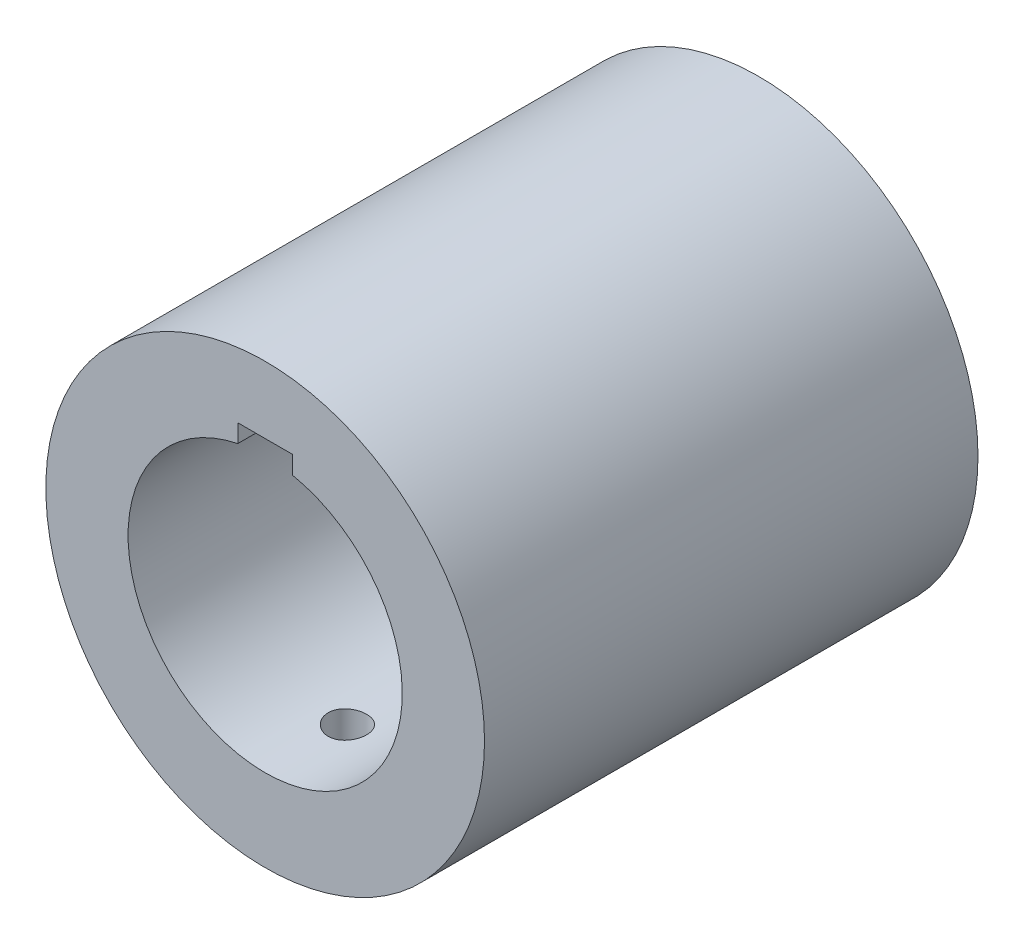
ISO-10303-21;
HEADER;
FILE_DESCRIPTION(('STEP AP214'),'2;1');
FILE_NAME('part.step','',(''),(''),'','','');
FILE_SCHEMA(('AUTOMOTIVE_DESIGN { 1 0 10303 214 1 1 1 1 }'));
ENDSEC;
DATA;
#1=APPLICATION_CONTEXT('core data for automotive mechanical design processes');
#2=APPLICATION_PROTOCOL_DEFINITION('international standard','automotive_design',2000,#1);
#3=PRODUCT_CONTEXT('',#1,'mechanical');
#4=PRODUCT('Part','Part','',(#3));
#5=PRODUCT_RELATED_PRODUCT_CATEGORY('part','',(#4));
#6=PRODUCT_DEFINITION_FORMATION('','',#4);
#7=PRODUCT_DEFINITION_CONTEXT('part definition',#1,'design');
#8=PRODUCT_DEFINITION('design','',#6,#7);
#9=PRODUCT_DEFINITION_SHAPE('','',#8);
#10=(LENGTH_UNIT() NAMED_UNIT(*) SI_UNIT(.MILLI.,.METRE.));
#11=(NAMED_UNIT(*) PLANE_ANGLE_UNIT() SI_UNIT($,.RADIAN.));
#12=(NAMED_UNIT(*) SI_UNIT($,.STERADIAN.) SOLID_ANGLE_UNIT());
#13=UNCERTAINTY_MEASURE_WITH_UNIT(LENGTH_MEASURE(1.E-05),#10,'distance_accuracy_value','');
#14=(GEOMETRIC_REPRESENTATION_CONTEXT(3) GLOBAL_UNCERTAINTY_ASSIGNED_CONTEXT((#13)) GLOBAL_UNIT_ASSIGNED_CONTEXT((#10,
#11,#12)) REPRESENTATION_CONTEXT('',''));
#15=CARTESIAN_POINT('',(0.,0.,0.));
#16=DIRECTION('',(0.,0.,1.));
#17=DIRECTION('',(1.,0.,0.));
#18=AXIS2_PLACEMENT_3D('',#15,#16,#17);
#19=CARTESIAN_POINT('',(0.,0.,-5.));
#20=DIRECTION('',(0.,0.,1.));
#21=DIRECTION('',(1.,0.,0.));
#22=AXIS2_PLACEMENT_3D('',#19,#20,#21);
#23=PLANE('',#22);
#24=CARTESIAN_POINT('',(0.,0.,-5.));
#25=DIRECTION('',(0.,0.,1.));
#26=DIRECTION('',(1.,0.,0.));
#27=AXIS2_PLACEMENT_3D('',#24,#25,#26);
#28=CIRCLE('',#27,25.);
#29=CARTESIAN_POINT('',(-22.5,10.8972473588517,-5.));
#30=VERTEX_POINT('',#29);
#31=CARTESIAN_POINT('',(-22.5,-10.8972473588517,-5.));
#32=VERTEX_POINT('',#31);
#33=EDGE_CURVE('E333',#30,#32,#28,.T.);
#34=ORIENTED_EDGE('',*,*,#33,.T.);
#35=DIRECTION('',(0.,1.,0.));
#36=VECTOR('',#35,1.);
#37=CARTESIAN_POINT('',(-22.5,-22.5,-5.));
#38=LINE('',#37,#36);
#39=EDGE_CURVE('E165',#32,#30,#38,.T.);
#40=ORIENTED_EDGE('',*,*,#39,.T.);
#41=EDGE_LOOP('',(#34,#40));
#42=FACE_BOUND('',#41,.T.);
#43=ADVANCED_FACE('F34',(#42),#23,.T.);
#44=CARTESIAN_POINT('',(-10.8972473588517,-22.5,-5.));
#45=VERTEX_POINT('',#44);
#46=CARTESIAN_POINT('',(10.8972473588517,-22.5,-5.));
#47=VERTEX_POINT('',#46);
#48=EDGE_CURVE('E336',#45,#47,#28,.T.);
#49=ORIENTED_EDGE('',*,*,#48,.T.);
#50=DIRECTION('',(-1.,0.,0.));
#51=VECTOR('',#50,1.);
#52=CARTESIAN_POINT('',(22.5,-22.5,-5.));
#53=LINE('',#52,#51);
#54=EDGE_CURVE('E181',#47,#45,#53,.T.);
#55=ORIENTED_EDGE('',*,*,#54,.T.);
#56=EDGE_LOOP('',(#49,#55));
#57=FACE_BOUND('',#56,.T.);
#58=ADVANCED_FACE('F270',(#57),#23,.T.);
#59=CARTESIAN_POINT('',(22.5,-10.8972473588517,-5.));
#60=VERTEX_POINT('',#59);
#61=CARTESIAN_POINT('',(22.5,10.8972473588517,-5.));
#62=VERTEX_POINT('',#61);
#63=EDGE_CURVE('E205',#60,#62,#28,.T.);
#64=ORIENTED_EDGE('',*,*,#63,.T.);
#65=DIRECTION('',(0.,-1.,0.));
#66=VECTOR('',#65,1.);
#67=CARTESIAN_POINT('',(22.5,-22.5,-5.));
#68=LINE('',#67,#66);
#69=EDGE_CURVE('E176',#62,#60,#68,.T.);
#70=ORIENTED_EDGE('',*,*,#69,.T.);
#71=EDGE_LOOP('',(#64,#70));
#72=FACE_BOUND('',#71,.T.);
#73=ADVANCED_FACE('F297',(#72),#23,.T.);
#74=CARTESIAN_POINT('',(10.8972473588517,22.5,-5.));
#75=VERTEX_POINT('',#74);
#76=CARTESIAN_POINT('',(-10.8972473588517,22.5,-5.));
#77=VERTEX_POINT('',#76);
#78=EDGE_CURVE('E204',#75,#77,#28,.T.);
#79=ORIENTED_EDGE('',*,*,#78,.T.);
#80=DIRECTION('',(1.,0.,0.));
#81=VECTOR('',#80,1.);
#82=CARTESIAN_POINT('',(22.5,22.5,-5.));
#83=LINE('',#82,#81);
#84=EDGE_CURVE('E171',#77,#75,#83,.T.);
#85=ORIENTED_EDGE('',*,*,#84,.T.);
#86=EDGE_LOOP('',(#79,#85));
#87=FACE_BOUND('',#86,.T.);
#88=ADVANCED_FACE('F272',(#87),#23,.T.);
#89=CARTESIAN_POINT('',(0.,0.,45.));
#90=DIRECTION('',(0.,0.,-1.));
#91=DIRECTION('',(-1.,0.,0.));
#92=AXIS2_PLACEMENT_3D('',#89,#90,#91);
#93=CYLINDRICAL_SURFACE('',#92,40.);
#94=CARTESIAN_POINT('',(3.50000000000001,-39.8465807817936,30.));
#95=CARTESIAN_POINT('',(3.49999144548066,-39.8465828091978,29.8038076306384));
#96=CARTESIAN_POINT('',(3.48344815437601,-39.848045370637,29.6074825909658));
#97=CARTESIAN_POINT('',(3.4176988145616,-39.8537373598452,29.2202671572285));
#98=CARTESIAN_POINT('',(3.36845599242042,-39.8579699026186,29.0293831343979));
#99=CARTESIAN_POINT('',(3.23874494533818,-39.8687188270403,28.6587137969815));
#100=CARTESIAN_POINT('',(3.15829470883662,-39.8752338927977,28.4789221576453));
#101=CARTESIAN_POINT('',(2.96848513385316,-39.8898121410542,28.135436284568));
#102=CARTESIAN_POINT('',(2.85913187331912,-39.8978749979746,27.9717386763694));
#103=CARTESIAN_POINT('',(2.61428817223653,-39.9146658266153,27.6645847506284));
#104=CARTESIAN_POINT('',(2.4787330919829,-39.9233954102467,27.5211800431389));
#105=CARTESIAN_POINT('',(2.18547081865469,-39.9405213601566,27.2591262991693));
#106=CARTESIAN_POINT('',(2.02776264776274,-39.9489177117055,27.1404783560052));
#107=CARTESIAN_POINT('',(1.69436079423247,-39.9644466087716,26.9311325562092));
#108=CARTESIAN_POINT('',(1.51863878883185,-39.97157711442,26.8404796419022));
#109=CARTESIAN_POINT('',(1.15439470745123,-39.9837534892168,26.6899846770912));
#110=CARTESIAN_POINT('',(0.965872876046101,-39.9887993981841,26.630142038062));
#111=CARTESIAN_POINT('',(0.581896545684229,-39.9962267639801,26.5431156879006));
#112=CARTESIAN_POINT('',(0.386461189328916,-39.9986150619891,26.5158481091684));
#113=CARTESIAN_POINT('',(-0.00622581578569751,-40.00048131454,26.4944865869159));
#114=CARTESIAN_POINT('',(-0.203477427580253,-39.9999593281823,26.500391969737));
#115=CARTESIAN_POINT('',(-0.5936288706037,-39.9960694592647,26.5451402698188));
#116=CARTESIAN_POINT('',(-0.786539134147017,-39.9927093690809,26.5838930015135));
#117=CARTESIAN_POINT('',(-1.16310660926702,-39.9835301116565,26.6930956586766));
#118=CARTESIAN_POINT('',(-1.34676372516993,-39.9777109189955,26.7635459118098));
#119=CARTESIAN_POINT('',(-1.69989790472234,-39.9642546126829,26.9342439214751));
#120=CARTESIAN_POINT('',(-1.86935540156573,-39.9566150445127,27.0345319558154));
#121=CARTESIAN_POINT('',(-2.1890665183457,-39.9403762100968,27.2620294743335));
#122=CARTESIAN_POINT('',(-2.33931970809755,-39.931776922361,27.3892395614074));
#123=CARTESIAN_POINT('',(-2.61688459673902,-39.9145507289992,27.6674781976517));
#124=CARTESIAN_POINT('',(-2.7441177325303,-39.9059238273874,27.8185851330038));
#125=CARTESIAN_POINT('',(-2.97142357440566,-39.8896436410195,28.1400552481662));
#126=CARTESIAN_POINT('',(-3.07149625462265,-39.8819903571907,28.3104184463156));
#127=CARTESIAN_POINT('',(-3.24163810647107,-39.8685227104348,28.6656214780195));
#128=CARTESIAN_POINT('',(-3.31170302023215,-39.8627086085041,28.8504633615892));
#129=CARTESIAN_POINT('',(-3.41978135650428,-39.8535828139277,29.2293496459934));
#130=CARTESIAN_POINT('',(-3.45779552297568,-39.8502710631978,29.4233938331142));
#131=CARTESIAN_POINT('',(-3.50059345308564,-39.8465345365353,29.8144885384048));
#132=CARTESIAN_POINT('',(-3.50548685603158,-39.8461002355129,30.0115269714325));
#133=CARTESIAN_POINT('',(-3.48219172428613,-39.8481426439256,30.4036212649625));
#134=CARTESIAN_POINT('',(-3.4540035302992,-39.8506193233807,30.598677145862));
#135=CARTESIAN_POINT('',(-3.36543684319893,-39.8581959549085,30.9809535341852));
#136=CARTESIAN_POINT('',(-3.30510967350783,-39.8632917240446,31.1681860222843));
#137=CARTESIAN_POINT('',(-3.15402972829005,-39.8755289233432,31.5298722032186));
#138=CARTESIAN_POINT('',(-3.06327641551469,-39.8826703896271,31.7043256703425));
#139=CARTESIAN_POINT('',(-2.85364355220502,-39.8982174090971,32.0360029727911));
#140=CARTESIAN_POINT('',(-2.73469103541274,-39.9066262206652,32.1931805355729));
#141=CARTESIAN_POINT('',(-2.47214158373285,-39.923749540086,32.4853763013431));
#142=CARTESIAN_POINT('',(-2.32854418162125,-39.9324640537318,32.6203940841258));
#143=CARTESIAN_POINT('',(-2.02030694242063,-39.9492453285108,32.8648127655354));
#144=CARTESIAN_POINT('',(-1.85561045090269,-39.9573102467596,32.9741423610453));
#145=CARTESIAN_POINT('',(-1.51013187344782,-39.9718570116321,33.1635916349912));
#146=CARTESIAN_POINT('',(-1.3293499623784,-39.9783388754626,33.2437116309218));
#147=CARTESIAN_POINT('',(-0.957086237403806,-39.9889807598233,33.3723453202784));
#148=CARTESIAN_POINT('',(-0.765619672356685,-39.9931440006835,33.4209028664738));
#149=CARTESIAN_POINT('',(-0.377213164756257,-39.9986926647472,33.4851765644692));
#150=CARTESIAN_POINT('',(-0.180273337576417,-40.0000781464594,33.5008934080025));
#151=CARTESIAN_POINT('',(0.212787038994882,-39.9999152489767,33.499031111851));
#152=CARTESIAN_POINT('',(0.408908127981969,-39.998376652303,33.4815629927268));
#153=CARTESIAN_POINT('',(0.795419488403757,-39.9925578027594,33.414058443548));
#154=CARTESIAN_POINT('',(0.9858097527334,-39.9882775464905,33.3640219731171));
#155=CARTESIAN_POINT('',(1.3554602489793,-39.9774554569329,33.2328299108569));
#156=CARTESIAN_POINT('',(1.53472130267503,-39.9709137908613,33.1516766198725));
#157=CARTESIAN_POINT('',(1.8770931421579,-39.9563001116113,32.9605670102535));
#158=CARTESIAN_POINT('',(2.04020414549786,-39.9482281190517,32.8506110796837));
#159=CARTESIAN_POINT('',(2.34621428686656,-39.9314271997662,32.6046005329049));
#160=CARTESIAN_POINT('',(2.48904712405537,-39.9226962548576,32.4684635834654));
#161=CARTESIAN_POINT('',(2.74989605095886,-39.9055786509445,32.1741083770454));
#162=CARTESIAN_POINT('',(2.86790613565591,-39.8971920756425,32.0158847923235));
#163=CARTESIAN_POINT('',(3.07593701159276,-39.8816944096419,31.6815100826822));
#164=CARTESIAN_POINT('',(3.16590059037033,-39.8745859385002,31.5053232728094));
#165=CARTESIAN_POINT('',(3.31485117004145,-39.8624810786097,31.1404009695002));
#166=CARTESIAN_POINT('',(3.3738736278164,-39.8574822735824,30.9516801201837));
#167=CARTESIAN_POINT('',(3.4443070897574,-39.8514425308533,30.6348800544647));
#168=CARTESIAN_POINT('',(3.46516398839713,-39.8496278116174,30.508835647448));
#169=CARTESIAN_POINT('',(3.4930132051891,-39.8471962794243,30.2552128736929));
#170=CARTESIAN_POINT('',(3.50000556521084,-39.8465794628496,30.1276345115881));
#171=CARTESIAN_POINT('',(3.50000000000001,-39.8465807817936,30.));
#172=B_SPLINE_CURVE_WITH_KNOTS('',3,(#94,#95,#96,#97,#98,#99,#100,#101,#102,#103,#104,#105,#106,
#107,#108,#109,#110,#111,#112,#113,#114,#115,#116,#117,#118,#119,#120,#121,#122,#123,#124,#125,
#126,#127,#128,#129,#130,#131,#132,#133,#134,#135,#136,#137,#138,#139,#140,#141,#142,#143,#144,
#145,#146,#147,#148,#149,#150,#151,#152,#153,#154,#155,#156,#157,#158,#159,#160,#161,#162,#163,
#164,#165,#166,#167,#168,#169,#170,#171),.UNSPECIFIED.,.T.,.F.,(4,2,2,2,2,2,2,2,2,2,2,2,2,2,2,2,
2,2,2,2,2,2,2,2,2,2,2,2,2,2,2,2,2,2,2,2,2,2,4),(0.,0.588111071995443,1.17688464802145,
1.76531934888771,2.35363040754074,2.94341178894665,3.53321921095353,4.12396862695151,
4.71470675827924,5.30392067744263,5.89312263121222,6.48071209478253,7.06830763254131,
7.6566999882121,8.2451055218155,8.83548277629812,9.4258605930425,10.0163221521094,
10.6067700050348,11.1952623447368,11.783748623661,12.3712979408373,12.9588576331943,
13.5479545747795,14.1370626858477,14.7277871702286,15.3185052335208,15.9084007906091,
16.4982839224291,17.086197070165,17.6741109467635,18.2619813601186,18.849843853358,
19.4395861960251,20.0294710430546,20.6205514476906,21.2109530166834,21.5935545233698,
21.976154874637),.UNSPECIFIED.);
#173=CARTESIAN_POINT('',(3.50000000000001,-39.8465807817936,30.));
#174=VERTEX_POINT('',#173);
#175=EDGE_CURVE('E156',#174,#174,#172,.T.);
#176=ORIENTED_EDGE('',*,*,#175,.T.);
#177=EDGE_LOOP('',(#176));
#178=FACE_BOUND('',#177,.T.);
#179=CARTESIAN_POINT('',(3.50000000000001,-39.8465807817936,-30.));
#180=CARTESIAN_POINT('',(3.49999144548066,-39.8465828091978,-30.1961923693616));
#181=CARTESIAN_POINT('',(3.48344815437601,-39.848045370637,-30.3925174090342));
#182=CARTESIAN_POINT('',(3.4176988145616,-39.8537373598452,-30.7797328427715));
#183=CARTESIAN_POINT('',(3.36845599242042,-39.8579699026186,-30.9706168656021));
#184=CARTESIAN_POINT('',(3.23874494533818,-39.8687188270403,-31.3412862030185));
#185=CARTESIAN_POINT('',(3.15829470883662,-39.8752338927977,-31.5210778423547));
#186=CARTESIAN_POINT('',(2.96848513385316,-39.8898121410542,-31.864563715432));
#187=CARTESIAN_POINT('',(2.85913187331912,-39.8978749979746,-32.0282613236306));
#188=CARTESIAN_POINT('',(2.61428817223653,-39.9146658266153,-32.3354152493716));
#189=CARTESIAN_POINT('',(2.4787330919829,-39.9233954102467,-32.4788199568611));
#190=CARTESIAN_POINT('',(2.18547081865469,-39.9405213601566,-32.7408737008307));
#191=CARTESIAN_POINT('',(2.02776264776274,-39.9489177117055,-32.8595216439948));
#192=CARTESIAN_POINT('',(1.69436079423247,-39.9644466087716,-33.0688674437908));
#193=CARTESIAN_POINT('',(1.51863878883184,-39.97157711442,-33.1595203580978));
#194=CARTESIAN_POINT('',(1.15439470745123,-39.9837534892168,-33.3100153229088));
#195=CARTESIAN_POINT('',(0.9658728760461,-39.9887993981841,-33.369857961938));
#196=CARTESIAN_POINT('',(0.581896545684229,-39.9962267639801,-33.4568843120994));
#197=CARTESIAN_POINT('',(0.386461189328916,-39.9986150619891,-33.4841518908316));
#198=CARTESIAN_POINT('',(-0.00622581578569732,-40.00048131454,-33.5055134130841));
#199=CARTESIAN_POINT('',(-0.203477427580253,-39.9999593281823,-33.499608030263));
#200=CARTESIAN_POINT('',(-0.5936288706037,-39.9960694592647,-33.4548597301812));
#201=CARTESIAN_POINT('',(-0.786539134147016,-39.9927093690809,-33.4161069984865));
#202=CARTESIAN_POINT('',(-1.16310660926701,-39.9835301116565,-33.3069043413234));
#203=CARTESIAN_POINT('',(-1.34676372516993,-39.9777109189955,-33.2364540881902));
#204=CARTESIAN_POINT('',(-1.69989790472234,-39.9642546126829,-33.0657560785249));
#205=CARTESIAN_POINT('',(-1.86935540156573,-39.9566150445127,-32.9654680441846));
#206=CARTESIAN_POINT('',(-2.18906651834569,-39.9403762100968,-32.7379705256665));
#207=CARTESIAN_POINT('',(-2.33931970809755,-39.931776922361,-32.6107604385926));
#208=CARTESIAN_POINT('',(-2.61688459673902,-39.9145507289992,-32.3325218023483));
#209=CARTESIAN_POINT('',(-2.7441177325303,-39.9059238273874,-32.1814148669962));
#210=CARTESIAN_POINT('',(-2.97142357440566,-39.8896436410195,-31.8599447518338));
#211=CARTESIAN_POINT('',(-3.07149625462265,-39.8819903571907,-31.6895815536844));
#212=CARTESIAN_POINT('',(-3.24163810647107,-39.8685227104348,-31.3343785219805));
#213=CARTESIAN_POINT('',(-3.31170302023215,-39.8627086085041,-31.1495366384108));
#214=CARTESIAN_POINT('',(-3.41978135650428,-39.8535828139277,-30.7706503540066));
#215=CARTESIAN_POINT('',(-3.45779552297568,-39.8502710631978,-30.5766061668858));
#216=CARTESIAN_POINT('',(-3.50059345308565,-39.8465345365353,-30.1855114615952));
#217=CARTESIAN_POINT('',(-3.50548685603158,-39.8461002355129,-29.9884730285675));
#218=CARTESIAN_POINT('',(-3.48219172428613,-39.8481426439256,-29.5963787350375));
#219=CARTESIAN_POINT('',(-3.4540035302992,-39.8506193233807,-29.401322854138));
#220=CARTESIAN_POINT('',(-3.36543684319893,-39.8581959549085,-29.0190464658147));
#221=CARTESIAN_POINT('',(-3.30510967350783,-39.8632917240446,-28.8318139777157));
#222=CARTESIAN_POINT('',(-3.15402972829006,-39.8755289233432,-28.4701277967814));
#223=CARTESIAN_POINT('',(-3.0632764155147,-39.8826703896271,-28.2956743296575));
#224=CARTESIAN_POINT('',(-2.85364355220502,-39.8982174090971,-27.9639970272089));
#225=CARTESIAN_POINT('',(-2.73469103541275,-39.9066262206652,-27.8068194644271));
#226=CARTESIAN_POINT('',(-2.47214158373286,-39.923749540086,-27.5146236986569));
#227=CARTESIAN_POINT('',(-2.32854418162126,-39.9324640537318,-27.3796059158742));
#228=CARTESIAN_POINT('',(-2.02030694242063,-39.9492453285108,-27.1351872344646));
#229=CARTESIAN_POINT('',(-1.85561045090269,-39.9573102467596,-27.0258576389547));
#230=CARTESIAN_POINT('',(-1.51013187344782,-39.9718570116321,-26.8364083650088));
#231=CARTESIAN_POINT('',(-1.3293499623784,-39.9783388754626,-26.7562883690782));
#232=CARTESIAN_POINT('',(-0.957086237403808,-39.9889807598233,-26.6276546797216));
#233=CARTESIAN_POINT('',(-0.765619672356687,-39.9931440006835,-26.5790971335262));
#234=CARTESIAN_POINT('',(-0.377213164756259,-39.9986926647472,-26.5148234355308));
#235=CARTESIAN_POINT('',(-0.180273337576418,-40.0000781464594,-26.4991065919975));
#236=CARTESIAN_POINT('',(0.212787038994882,-39.9999152489767,-26.500968888149));
#237=CARTESIAN_POINT('',(0.40890812798197,-39.998376652303,-26.5184370072732));
#238=CARTESIAN_POINT('',(0.795419488403758,-39.9925578027594,-26.585941556452));
#239=CARTESIAN_POINT('',(0.9858097527334,-39.9882775464905,-26.6359780268829));
#240=CARTESIAN_POINT('',(1.3554602489793,-39.9774554569329,-26.7671700891432));
#241=CARTESIAN_POINT('',(1.53472130267503,-39.9709137908613,-26.8483233801275));
#242=CARTESIAN_POINT('',(1.8770931421579,-39.9563001116113,-27.0394329897465));
#243=CARTESIAN_POINT('',(2.04020414549786,-39.9482281190517,-27.1493889203163));
#244=CARTESIAN_POINT('',(2.34621428686656,-39.9314271997662,-27.3953994670951));
#245=CARTESIAN_POINT('',(2.48904712405537,-39.9226962548576,-27.5315364165346));
#246=CARTESIAN_POINT('',(2.74989605095886,-39.9055786509445,-27.8258916229545));
#247=CARTESIAN_POINT('',(2.86790613565591,-39.8971920756425,-27.9841152076765));
#248=CARTESIAN_POINT('',(3.07593701159277,-39.8816944096419,-28.3184899173178));
#249=CARTESIAN_POINT('',(3.16590059037034,-39.8745859385002,-28.4946767271906));
#250=CARTESIAN_POINT('',(3.31485117004145,-39.8624810786097,-28.8595990304998));
#251=CARTESIAN_POINT('',(3.3738736278164,-39.8574822735824,-29.0483198798163));
#252=CARTESIAN_POINT('',(3.4443070897574,-39.8514425308533,-29.3651199455353));
#253=CARTESIAN_POINT('',(3.46516398839713,-39.8496278116174,-29.491164352552));
#254=CARTESIAN_POINT('',(3.4930132051891,-39.8471962794243,-29.7447871263071));
#255=CARTESIAN_POINT('',(3.50000556521084,-39.8465794628496,-29.8723654884119));
#256=CARTESIAN_POINT('',(3.50000000000001,-39.8465807817936,-30.));
#257=B_SPLINE_CURVE_WITH_KNOTS('',3,(#179,#180,#181,#182,#183,#184,#185,#186,#187,#188,#189,
#190,#191,#192,#193,#194,#195,#196,#197,#198,#199,#200,#201,#202,#203,#204,#205,#206,#207,#208,
#209,#210,#211,#212,#213,#214,#215,#216,#217,#218,#219,#220,#221,#222,#223,#224,#225,#226,#227,
#228,#229,#230,#231,#232,#233,#234,#235,#236,#237,#238,#239,#240,#241,#242,#243,#244,#245,#246,
#247,#248,#249,#250,#251,#252,#253,#254,#255,#256),.UNSPECIFIED.,.T.,.F.,(4,2,2,2,2,2,2,2,2,2,2,
2,2,2,2,2,2,2,2,2,2,2,2,2,2,2,2,2,2,2,2,2,2,2,2,2,2,2,4),(0.,0.588111071995446,1.17688464802145,
1.7653193488877,2.35363040754075,2.94341178894665,3.53321921095353,4.12396862695152,
4.71470675827924,5.30392067744263,5.89312263121222,6.48071209478253,7.06830763254131,
7.65669998821209,8.2451055218155,8.83548277629812,9.4258605930425,10.0163221521094,
10.6067700050348,11.1952623447368,11.783748623661,12.3712979408373,12.9588576331943,
13.5479545747795,14.1370626858477,14.7277871702286,15.3185052335208,15.9084007906091,
16.4982839224291,17.086197070165,17.6741109467635,18.2619813601186,18.849843853358,
19.4395861960251,20.0294710430546,20.6205514476906,21.2109530166834,21.5935545233698,
21.976154874637),.UNSPECIFIED.);
#258=CARTESIAN_POINT('',(3.50000000000001,-39.8465807817936,-30.));
#259=VERTEX_POINT('',#258);
#260=EDGE_CURVE('E216',#259,#259,#257,.T.);
#261=ORIENTED_EDGE('',*,*,#260,.T.);
#262=EDGE_LOOP('',(#261));
#263=FACE_BOUND('',#262,.T.);
#264=CARTESIAN_POINT('',(0.,0.,45.));
#265=DIRECTION('',(0.,0.,1.));
#266=DIRECTION('',(1.,0.,0.));
#267=AXIS2_PLACEMENT_3D('',#264,#265,#266);
#268=CIRCLE('',#267,40.);
#269=CARTESIAN_POINT('',(40.,0.,45.));
#270=VERTEX_POINT('',#269);
#271=EDGE_CURVE('E208',#270,#270,#268,.T.);
#272=ORIENTED_EDGE('',*,*,#271,.F.);
#273=EDGE_LOOP('',(#272));
#274=FACE_BOUND('',#273,.T.);
#275=CARTESIAN_POINT('',(0.,0.,-45.));
#276=DIRECTION('',(0.,0.,1.));
#277=DIRECTION('',(1.,0.,0.));
#278=AXIS2_PLACEMENT_3D('',#275,#276,#277);
#279=CIRCLE('',#278,40.);
#280=CARTESIAN_POINT('',(40.,0.,-45.));
#281=VERTEX_POINT('',#280);
#282=EDGE_CURVE('E203',#281,#281,#279,.T.);
#283=ORIENTED_EDGE('',*,*,#282,.T.);
#284=EDGE_LOOP('',(#283));
#285=FACE_BOUND('',#284,.T.);
#286=ADVANCED_FACE('F36',(#178,#263,#274,#285),#93,.T.);
#287=CARTESIAN_POINT('',(0.,0.,45.));
#288=DIRECTION('',(0.,0.,1.));
#289=DIRECTION('',(1.,0.,0.));
#290=AXIS2_PLACEMENT_3D('',#287,#288,#289);
#291=PLANE('',#290);
#292=DIRECTION('',(0.,-1.,0.));
#293=VECTOR('',#292,1.);
#294=CARTESIAN_POINT('',(-5.,15.79,45.));
#295=LINE('',#294,#293);
#296=CARTESIAN_POINT('',(-5.,27.79,45.));
#297=VERTEX_POINT('',#296);
#298=CARTESIAN_POINT('',(-5.,24.4948974278318,45.));
#299=VERTEX_POINT('',#298);
#300=EDGE_CURVE('E154',#297,#299,#295,.T.);
#301=ORIENTED_EDGE('',*,*,#300,.F.);
#302=DIRECTION('',(-1.,0.,0.));
#303=VECTOR('',#302,1.);
#304=CARTESIAN_POINT('',(5.,27.79,45.));
#305=LINE('',#304,#303);
#306=CARTESIAN_POINT('',(5.,27.79,45.));
#307=VERTEX_POINT('',#306);
#308=EDGE_CURVE('E158',#307,#297,#305,.T.);
#309=ORIENTED_EDGE('',*,*,#308,.F.);
#310=DIRECTION('',(0.,1.,0.));
#311=VECTOR('',#310,1.);
#312=CARTESIAN_POINT('',(5.,15.79,45.));
#313=LINE('',#312,#311);
#314=CARTESIAN_POINT('',(5.,24.4948974278318,45.));
#315=VERTEX_POINT('',#314);
#316=EDGE_CURVE('E144',#315,#307,#313,.T.);
#317=ORIENTED_EDGE('',*,*,#316,.F.);
#318=CARTESIAN_POINT('',(0.,0.,45.));
#319=DIRECTION('',(0.,0.,1.));
#320=DIRECTION('',(1.,0.,0.));
#321=AXIS2_PLACEMENT_3D('',#318,#319,#320);
#322=CIRCLE('',#321,25.);
#323=EDGE_CURVE('E194',#299,#315,#322,.T.);
#324=ORIENTED_EDGE('',*,*,#323,.F.);
#325=EDGE_LOOP('',(#301,#309,#317,#324));
#326=FACE_BOUND('',#325,.T.);
#327=ORIENTED_EDGE('',*,*,#271,.T.);
#328=EDGE_LOOP('',(#327));
#329=FACE_BOUND('',#328,.T.);
#330=ADVANCED_FACE('F279',(#326,#329),#291,.T.);
#331=CARTESIAN_POINT('',(0.,0.,-45.));
#332=DIRECTION('',(0.,0.,1.));
#333=DIRECTION('',(1.,0.,0.));
#334=AXIS2_PLACEMENT_3D('',#331,#332,#333);
#335=PLANE('',#334);
#336=DIRECTION('',(1.,0.,0.));
#337=VECTOR('',#336,1.);
#338=CARTESIAN_POINT('',(22.5,22.5,-45.));
#339=LINE('',#338,#337);
#340=CARTESIAN_POINT('',(-22.5,22.5,-45.));
#341=VERTEX_POINT('',#340);
#342=CARTESIAN_POINT('',(22.5,22.5,-45.));
#343=VERTEX_POINT('',#342);
#344=EDGE_CURVE('E183',#341,#343,#339,.T.);
#345=ORIENTED_EDGE('',*,*,#344,.F.);
#346=DIRECTION('',(0.,1.,0.));
#347=VECTOR('',#346,1.);
#348=CARTESIAN_POINT('',(-22.5,-22.5,-45.));
#349=LINE('',#348,#347);
#350=CARTESIAN_POINT('',(-22.5,-22.5,-45.));
#351=VERTEX_POINT('',#350);
#352=EDGE_CURVE('E160',#351,#341,#349,.T.);
#353=ORIENTED_EDGE('',*,*,#352,.F.);
#354=DIRECTION('',(-1.,0.,0.));
#355=VECTOR('',#354,1.);
#356=CARTESIAN_POINT('',(22.5,-22.5,-45.));
#357=LINE('',#356,#355);
#358=CARTESIAN_POINT('',(22.5,-22.5,-45.));
#359=VERTEX_POINT('',#358);
#360=EDGE_CURVE('E189',#359,#351,#357,.T.);
#361=ORIENTED_EDGE('',*,*,#360,.F.);
#362=DIRECTION('',(0.,-1.,0.));
#363=VECTOR('',#362,1.);
#364=CARTESIAN_POINT('',(22.5,-22.5,-45.));
#365=LINE('',#364,#363);
#366=EDGE_CURVE('E186',#343,#359,#365,.T.);
#367=ORIENTED_EDGE('',*,*,#366,.F.);
#368=EDGE_LOOP('',(#345,#353,#361,#367));
#369=FACE_BOUND('',#368,.T.);
#370=ORIENTED_EDGE('',*,*,#282,.F.);
#371=EDGE_LOOP('',(#370));
#372=FACE_BOUND('',#371,.T.);
#373=ADVANCED_FACE('F277',(#369,#372),#335,.F.);
#374=CARTESIAN_POINT('',(0.,0.,-5.));
#375=DIRECTION('',(0.,0.,1.));
#376=DIRECTION('',(1.,0.,0.));
#377=AXIS2_PLACEMENT_3D('',#374,#375,#376);
#378=CYLINDRICAL_SURFACE('',#377,25.);
#379=CARTESIAN_POINT('',(3.5,-24.7537875889731,30.));
#380=CARTESIAN_POINT('',(3.49999181655908,-24.7537906822583,30.1955601547676));
#381=CARTESIAN_POINT('',(3.48355443558926,-24.7561300920155,30.3912375074826));
#382=CARTESIAN_POINT('',(3.41825061741057,-24.76522981384,30.7771319227347));
#383=CARTESIAN_POINT('',(3.369351598623,-24.7719945675026,30.9673432987802));
#384=CARTESIAN_POINT('',(3.24060697003299,-24.7891640928697,31.3366635933041));
#385=CARTESIAN_POINT('',(3.16078395095831,-24.7995662068558,31.5157805060199));
#386=CARTESIAN_POINT('',(2.97250847563925,-24.8228352266466,31.8580487736026));
#387=CARTESIAN_POINT('',(2.86406036070284,-24.8357017586143,32.0212025443155));
#388=CARTESIAN_POINT('',(2.62080281251527,-24.8625504844522,32.3280821585328));
#389=CARTESIAN_POINT('',(2.48583292443021,-24.8765391460462,32.4716802619453));
#390=CARTESIAN_POINT('',(2.1937092685365,-24.9039980636581,32.7342668050627));
#391=CARTESIAN_POINT('',(2.03655433171448,-24.9174682923102,32.8532539471089));
#392=CARTESIAN_POINT('',(1.7037092427828,-24.9424397352459,33.0637071845744));
#393=CARTESIAN_POINT('',(1.5279445235745,-24.9539325035401,33.1550564349266));
#394=CARTESIAN_POINT('',(1.16337996516018,-24.9735826810557,33.3068916070161));
#395=CARTESIAN_POINT('',(0.974580728438621,-24.9817402443171,33.3673789541766));
#396=CARTESIAN_POINT('',(0.590618783329349,-24.9937552741093,33.4553882385259));
#397=CARTESIAN_POINT('',(0.395505865512715,-24.9976405609784,33.4831235400346));
#398=CARTESIAN_POINT('',(0.0033592271211936,-25.0007684801016,33.5055034093904));
#399=CARTESIAN_POINT('',(-0.19367439934007,-25.0000113387018,33.5001495905289));
#400=CARTESIAN_POINT('',(-0.582615400058754,-24.9939620558024,33.4566726713099));
#401=CARTESIAN_POINT('',(-0.774548993633266,-24.9887016775951,33.4187790823591));
#402=CARTESIAN_POINT('',(-1.14930594030171,-24.9742724352295,33.3116579163287));
#403=CARTESIAN_POINT('',(-1.33212908391207,-24.9651034812448,33.2424296191148));
#404=CARTESIAN_POINT('',(-1.68417680329686,-24.9438325860369,33.0743653931127));
#405=CARTESIAN_POINT('',(-1.85335410431119,-24.9317209865754,32.9754317089632));
#406=CARTESIAN_POINT('',(-2.17279223786522,-24.9059168552186,32.7508363280671));
#407=CARTESIAN_POINT('',(-2.32305198304022,-24.8922242325342,32.6251730960448));
#408=CARTESIAN_POINT('',(-2.60174071972401,-24.8646488503525,32.3494042316552));
#409=CARTESIAN_POINT('',(-2.72997158820307,-24.8507654670317,32.1990983593784));
#410=CARTESIAN_POINT('',(-2.95941854341812,-24.8244883316295,31.8789943235083));
#411=CARTESIAN_POINT('',(-3.06063450181283,-24.8120945866252,31.7091960673168));
#412=CARTESIAN_POINT('',(-3.23319870278262,-24.7902003566841,31.3547333711027));
#413=CARTESIAN_POINT('',(-3.30452848048122,-24.7807016614096,31.17005982428));
#414=CARTESIAN_POINT('',(-3.4151062164336,-24.7657059743542,30.7911922096729));
#415=CARTESIAN_POINT('',(-3.45435613146934,-24.7602087384978,30.5969987233443));
#416=CARTESIAN_POINT('',(-3.4993922100537,-24.7538840422246,30.2063609476892));
#417=CARTESIAN_POINT('',(-3.5054583674837,-24.7530175108533,30.009949548225));
#418=CARTESIAN_POINT('',(-3.48469592776276,-24.7559487782451,29.6189131069279));
#419=CARTESIAN_POINT('',(-3.45786821570799,-24.7597464515054,29.4242880171718));
#420=CARTESIAN_POINT('',(-3.37231633400958,-24.7715424400724,29.0432043339317));
#421=CARTESIAN_POINT('',(-3.31373000542301,-24.7795225973313,28.8567141846912));
#422=CARTESIAN_POINT('',(-3.16646669264685,-24.7987695354145,28.4962023722164));
#423=CARTESIAN_POINT('',(-3.0777884005381,-24.8100364590921,28.3221812513349));
#424=CARTESIAN_POINT('',(-2.87217909544422,-24.8346801452907,27.9902872650861));
#425=CARTESIAN_POINT('',(-2.7550658360138,-24.8480703159863,27.8325283143095));
#426=CARTESIAN_POINT('',(-2.49616615385767,-24.875410682501,27.5388042112551));
#427=CARTESIAN_POINT('',(-2.3543785207939,-24.8893609057662,27.4028401286975));
#428=CARTESIAN_POINT('',(-2.04892599936428,-24.9163707911094,27.1555689967601));
#429=CARTESIAN_POINT('',(-1.88511070591751,-24.9294233048069,27.044446847283));
#430=CARTESIAN_POINT('',(-1.54097657080112,-24.9530578482668,26.8512984093059));
#431=CARTESIAN_POINT('',(-1.36065813219229,-24.9636399383426,26.7692714104456));
#432=CARTESIAN_POINT('',(-0.989229139282787,-24.9811098395859,26.6369413435228));
#433=CARTESIAN_POINT('',(-0.798156053861411,-24.9880096937281,26.5865347628721));
#434=CARTESIAN_POINT('',(-0.410154489529999,-24.9973880303632,26.5185406087299));
#435=CARTESIAN_POINT('',(-0.213226346094652,-24.9998667656766,26.5009511585971));
#436=CARTESIAN_POINT('',(0.179096941501438,-25.000121613377,26.4991318441549));
#437=CARTESIAN_POINT('',(0.374490803444377,-24.9979377352712,26.5146181598069));
#438=CARTESIAN_POINT('',(0.759868138965532,-24.9891929064383,26.5779054710853));
#439=CARTESIAN_POINT('',(0.94985162365863,-24.9826319647038,26.6257064003208));
#440=CARTESIAN_POINT('',(1.31895434116068,-24.9658667061347,26.7521701107837));
#441=CARTESIAN_POINT('',(1.49807954152819,-24.9556644121669,26.8308157593527));
#442=CARTESIAN_POINT('',(1.84063575824958,-24.9327408556312,27.0167066789478));
#443=CARTESIAN_POINT('',(2.00406639879783,-24.9200195327676,27.123952634575));
#444=CARTESIAN_POINT('',(2.31203862615956,-24.8933445340092,27.3650365723487));
#445=CARTESIAN_POINT('',(2.45641476524127,-24.8793816286934,27.4990849008835));
#446=CARTESIAN_POINT('',(2.72072938480253,-24.8518678878302,27.7895269332121));
#447=CARTESIAN_POINT('',(2.84066210449927,-24.8383171500605,27.9459258898225));
#448=CARTESIAN_POINT('',(3.05319975931054,-24.8130916210476,28.277515709406));
#449=CARTESIAN_POINT('',(3.14566908745316,-24.801426264232,28.452794183429));
#450=CARTESIAN_POINT('',(3.29972220584237,-24.7814027288131,28.8164676001087));
#451=CARTESIAN_POINT('',(3.36133869990586,-24.7730410503233,29.0048484120192));
#452=CARTESIAN_POINT('',(3.43762752385745,-24.7625452599898,29.3284431130035));
#453=CARTESIAN_POINT('',(3.46098233554848,-24.759278094514,29.461639355196));
#454=CARTESIAN_POINT('',(3.49217131855817,-24.7548982019194,29.7298717689412));
#455=CARTESIAN_POINT('',(3.50000565308434,-24.7537854521456,29.8649079211311));
#456=CARTESIAN_POINT('',(3.5,-24.7537875889731,30.));
#457=B_SPLINE_CURVE_WITH_KNOTS('',3,(#379,#380,#381,#382,#383,#384,#385,#386,#387,#388,#389,
#390,#391,#392,#393,#394,#395,#396,#397,#398,#399,#400,#401,#402,#403,#404,#405,#406,#407,#408,
#409,#410,#411,#412,#413,#414,#415,#416,#417,#418,#419,#420,#421,#422,#423,#424,#425,#426,#427,
#428,#429,#430,#431,#432,#433,#434,#435,#436,#437,#438,#439,#440,#441,#442,#443,#444,#445,#446,
#447,#448,#449,#450,#451,#452,#453,#454,#455,#456),.UNSPECIFIED.,.T.,.F.,(4,2,2,2,2,2,2,2,2,2,2,
2,2,2,2,2,2,2,2,2,2,2,2,2,2,2,2,2,2,2,2,2,2,2,2,2,2,2,4),(0.,0.586186802715843,1.17296284945571,
1.75931104800062,2.34557037149055,2.93549224141235,3.52544520813938,4.11785855282521,
4.71024453315484,5.29874972351532,5.88722622097413,6.47158581791365,7.05595884528781,
7.64227642364724,8.22862768766166,8.82000392576342,9.41138297329996,10.0031268615642,
10.5948346524106,11.1815420123042,11.7682335856381,12.3523989110571,12.9365896299306,
13.5246282706496,14.1126957642295,14.7050044334248,15.2972986403631,15.887643653788,
16.4779549074112,17.0632211173544,17.6484861248614,18.233426507049,18.8183808921209,
19.4081201968966,19.997998330098,20.5907424672804,21.1828569621122,21.58779643772,
21.9927316551138),.UNSPECIFIED.);
#458=CARTESIAN_POINT('',(3.5,-24.7537875889731,30.));
#459=VERTEX_POINT('',#458);
#460=EDGE_CURVE('E39',#459,#459,#457,.T.);
#461=ORIENTED_EDGE('',*,*,#460,.T.);
#462=EDGE_LOOP('',(#461));
#463=FACE_BOUND('',#462,.T.);
#464=EDGE_CURVE('E201',#62,#75,#28,.T.);
#465=ORIENTED_EDGE('',*,*,#464,.F.);
#466=ORIENTED_EDGE('',*,*,#63,.F.);
#467=EDGE_CURVE('E340',#47,#60,#28,.T.);
#468=ORIENTED_EDGE('',*,*,#467,.F.);
#469=ORIENTED_EDGE('',*,*,#48,.F.);
#470=EDGE_CURVE('E334',#32,#45,#28,.T.);
#471=ORIENTED_EDGE('',*,*,#470,.F.);
#472=ORIENTED_EDGE('',*,*,#33,.F.);
#473=EDGE_CURVE('E327',#77,#30,#28,.T.);
#474=ORIENTED_EDGE('',*,*,#473,.F.);
#475=ORIENTED_EDGE('',*,*,#78,.F.);
#476=EDGE_LOOP('',(#465,#466,#468,#469,#471,#472,#474,#475));
#477=FACE_BOUND('',#476,.T.);
#478=CARTESIAN_POINT('',(0.,0.,5.));
#479=DIRECTION('',(0.,0.,1.));
#480=DIRECTION('',(1.,0.,0.));
#481=AXIS2_PLACEMENT_3D('',#478,#479,#480);
#482=CIRCLE('',#481,25.);
#483=CARTESIAN_POINT('',(-5.,24.4948974278318,5.));
#484=VERTEX_POINT('',#483);
#485=CARTESIAN_POINT('',(5.,24.4948974278318,5.));
#486=VERTEX_POINT('',#485);
#487=EDGE_CURVE('E136',#484,#486,#482,.F.);
#488=ORIENTED_EDGE('',*,*,#487,.F.);
#489=DIRECTION('',(0.,0.,1.));
#490=VECTOR('',#489,1.);
#491=CARTESIAN_POINT('',(-5.,24.4948974278318,-5.));
#492=LINE('',#491,#490);
#493=EDGE_CURVE('E11',#484,#299,#492,.T.);
#494=ORIENTED_EDGE('',*,*,#493,.T.);
#495=ORIENTED_EDGE('',*,*,#323,.T.);
#496=DIRECTION('',(0.,0.,1.));
#497=VECTOR('',#496,1.);
#498=CARTESIAN_POINT('',(5.,24.4948974278318,-5.));
#499=LINE('',#498,#497);
#500=EDGE_CURVE('E49',#315,#486,#499,.F.);
#501=ORIENTED_EDGE('',*,*,#500,.T.);
#502=EDGE_LOOP('',(#488,#494,#495,#501));
#503=FACE_BOUND('',#502,.T.);
#504=ADVANCED_FACE('F273',(#463,#477,#503),#378,.F.);
#505=CARTESIAN_POINT('',(0.,0.,-5.));
#506=DIRECTION('',(0.,0.,1.));
#507=DIRECTION('',(1.,0.,0.));
#508=AXIS2_PLACEMENT_3D('',#505,#506,#507);
#509=PLANE('',#508);
#510=ORIENTED_EDGE('',*,*,#464,.T.);
#511=CARTESIAN_POINT('',(22.5,22.5,-5.));
#512=VERTEX_POINT('',#511);
#513=EDGE_CURVE('E65',#75,#512,#83,.T.);
#514=ORIENTED_EDGE('',*,*,#513,.T.);
#515=EDGE_CURVE('E172',#512,#62,#68,.T.);
#516=ORIENTED_EDGE('',*,*,#515,.T.);
#517=EDGE_LOOP('',(#510,#514,#516));
#518=FACE_BOUND('',#517,.T.);
#519=ADVANCED_FACE('F254',(#518),#509,.F.);
#520=ORIENTED_EDGE('',*,*,#473,.T.);
#521=CARTESIAN_POINT('',(-22.5,22.5,-5.));
#522=VERTEX_POINT('',#521);
#523=EDGE_CURVE('E166',#30,#522,#38,.T.);
#524=ORIENTED_EDGE('',*,*,#523,.T.);
#525=EDGE_CURVE('E167',#522,#77,#83,.T.);
#526=ORIENTED_EDGE('',*,*,#525,.T.);
#527=EDGE_LOOP('',(#520,#524,#526));
#528=FACE_BOUND('',#527,.T.);
#529=ADVANCED_FACE('F326',(#528),#509,.F.);
#530=ORIENTED_EDGE('',*,*,#470,.T.);
#531=CARTESIAN_POINT('',(-22.5,-22.5,-5.));
#532=VERTEX_POINT('',#531);
#533=EDGE_CURVE('E175',#45,#532,#53,.T.);
#534=ORIENTED_EDGE('',*,*,#533,.T.);
#535=EDGE_CURVE('E162',#532,#32,#38,.T.);
#536=ORIENTED_EDGE('',*,*,#535,.T.);
#537=EDGE_LOOP('',(#530,#534,#536));
#538=FACE_BOUND('',#537,.T.);
#539=ADVANCED_FACE('F255',(#538),#509,.F.);
#540=CARTESIAN_POINT('',(-22.5,-22.5,-5.));
#541=DIRECTION('',(-1.,0.,0.));
#542=DIRECTION('',(0.,0.,1.));
#543=AXIS2_PLACEMENT_3D('',#540,#541,#542);
#544=PLANE('',#543);
#545=ORIENTED_EDGE('',*,*,#352,.T.);
#546=DIRECTION('',(0.,0.,-1.));
#547=VECTOR('',#546,1.);
#548=CARTESIAN_POINT('',(-22.5,22.5,-5.));
#549=LINE('',#548,#547);
#550=EDGE_CURVE('E180',#522,#341,#549,.T.);
#551=ORIENTED_EDGE('',*,*,#550,.F.);
#552=ORIENTED_EDGE('',*,*,#523,.F.);
#553=ORIENTED_EDGE('',*,*,#39,.F.);
#554=ORIENTED_EDGE('',*,*,#535,.F.);
#555=DIRECTION('',(0.,0.,-1.));
#556=VECTOR('',#555,1.);
#557=CARTESIAN_POINT('',(-22.5,-22.5,-5.));
#558=LINE('',#557,#556);
#559=EDGE_CURVE('E192',#532,#351,#558,.T.);
#560=ORIENTED_EDGE('',*,*,#559,.T.);
#561=EDGE_LOOP('',(#545,#551,#552,#553,#554,#560));
#562=FACE_BOUND('',#561,.T.);
#563=ADVANCED_FACE('F260',(#562),#544,.F.);
#564=CARTESIAN_POINT('',(22.5,-22.5,-5.));
#565=DIRECTION('',(0.,-1.,0.));
#566=DIRECTION('',(0.,0.,-1.));
#567=AXIS2_PLACEMENT_3D('',#564,#565,#566);
#568=PLANE('',#567);
#569=CARTESIAN_POINT('',(0.,-22.5,-30.));
#570=DIRECTION('',(0.,-1.,0.));
#571=DIRECTION('',(0.,0.,-1.));
#572=AXIS2_PLACEMENT_3D('',#569,#570,#571);
#573=CIRCLE('',#572,3.5);
#574=CARTESIAN_POINT('',(0.,-22.5,-33.5));
#575=VERTEX_POINT('',#574);
#576=EDGE_CURVE('E214',#575,#575,#573,.T.);
#577=ORIENTED_EDGE('',*,*,#576,.T.);
#578=EDGE_LOOP('',(#577));
#579=FACE_BOUND('',#578,.T.);
#580=ORIENTED_EDGE('',*,*,#360,.T.);
#581=ORIENTED_EDGE('',*,*,#559,.F.);
#582=ORIENTED_EDGE('',*,*,#533,.F.);
#583=ORIENTED_EDGE('',*,*,#54,.F.);
#584=CARTESIAN_POINT('',(22.5,-22.5,-5.));
#585=VERTEX_POINT('',#584);
#586=EDGE_CURVE('E177',#585,#47,#53,.T.);
#587=ORIENTED_EDGE('',*,*,#586,.F.);
#588=DIRECTION('',(0.,0.,-1.));
#589=VECTOR('',#588,1.);
#590=CARTESIAN_POINT('',(22.5,-22.5,-5.));
#591=LINE('',#590,#589);
#592=EDGE_CURVE('E195',#585,#359,#591,.T.);
#593=ORIENTED_EDGE('',*,*,#592,.T.);
#594=EDGE_LOOP('',(#580,#581,#582,#583,#587,#593));
#595=FACE_BOUND('',#594,.T.);
#596=ADVANCED_FACE('F256',(#579,#595),#568,.F.);
#597=CARTESIAN_POINT('',(22.5,-22.5,-5.));
#598=DIRECTION('',(1.,0.,0.));
#599=DIRECTION('',(0.,0.,-1.));
#600=AXIS2_PLACEMENT_3D('',#597,#598,#599);
#601=PLANE('',#600);
#602=ORIENTED_EDGE('',*,*,#366,.T.);
#603=ORIENTED_EDGE('',*,*,#592,.F.);
#604=EDGE_CURVE('E170',#60,#585,#68,.T.);
#605=ORIENTED_EDGE('',*,*,#604,.F.);
#606=ORIENTED_EDGE('',*,*,#69,.F.);
#607=ORIENTED_EDGE('',*,*,#515,.F.);
#608=DIRECTION('',(0.,0.,-1.));
#609=VECTOR('',#608,1.);
#610=CARTESIAN_POINT('',(22.5,22.5,-5.));
#611=LINE('',#610,#609);
#612=EDGE_CURVE('E197',#512,#343,#611,.T.);
#613=ORIENTED_EDGE('',*,*,#612,.T.);
#614=EDGE_LOOP('',(#602,#603,#605,#606,#607,#613));
#615=FACE_BOUND('',#614,.T.);
#616=ADVANCED_FACE('F259',(#615),#601,.F.);
#617=CARTESIAN_POINT('',(22.5,22.5,-5.));
#618=DIRECTION('',(0.,1.,0.));
#619=DIRECTION('',(0.,0.,1.));
#620=AXIS2_PLACEMENT_3D('',#617,#618,#619);
#621=PLANE('',#620);
#622=ORIENTED_EDGE('',*,*,#344,.T.);
#623=ORIENTED_EDGE('',*,*,#612,.F.);
#624=ORIENTED_EDGE('',*,*,#513,.F.);
#625=ORIENTED_EDGE('',*,*,#84,.F.);
#626=ORIENTED_EDGE('',*,*,#525,.F.);
#627=ORIENTED_EDGE('',*,*,#550,.T.);
#628=EDGE_LOOP('',(#622,#623,#624,#625,#626,#627));
#629=FACE_BOUND('',#628,.T.);
#630=ADVANCED_FACE('F252',(#629),#621,.F.);
#631=ORIENTED_EDGE('',*,*,#467,.T.);
#632=ORIENTED_EDGE('',*,*,#604,.T.);
#633=ORIENTED_EDGE('',*,*,#586,.T.);
#634=EDGE_LOOP('',(#631,#632,#633));
#635=FACE_BOUND('',#634,.T.);
#636=ADVANCED_FACE('F248',(#635),#509,.F.);
#637=CARTESIAN_POINT('',(-5.,15.79,5.));
#638=DIRECTION('',(-1.,0.,0.));
#639=DIRECTION('',(0.,0.,1.));
#640=AXIS2_PLACEMENT_3D('',#637,#638,#639);
#641=PLANE('',#640);
#642=DIRECTION('',(0.,-1.,0.));
#643=VECTOR('',#642,1.);
#644=CARTESIAN_POINT('',(-5.,15.79,5.));
#645=LINE('',#644,#643);
#646=CARTESIAN_POINT('',(-5.,27.79,5.));
#647=VERTEX_POINT('',#646);
#648=EDGE_CURVE('E57',#647,#484,#645,.T.);
#649=ORIENTED_EDGE('',*,*,#648,.F.);
#650=DIRECTION('',(0.,0.,1.));
#651=VECTOR('',#650,1.);
#652=CARTESIAN_POINT('',(-5.,27.79,5.));
#653=LINE('',#652,#651);
#654=EDGE_CURVE('E148',#647,#297,#653,.T.);
#655=ORIENTED_EDGE('',*,*,#654,.T.);
#656=ORIENTED_EDGE('',*,*,#300,.T.);
#657=ORIENTED_EDGE('',*,*,#493,.F.);
#658=EDGE_LOOP('',(#649,#655,#656,#657));
#659=FACE_BOUND('',#658,.T.);
#660=ADVANCED_FACE('F245',(#659),#641,.F.);
#661=CARTESIAN_POINT('',(5.,15.79,5.));
#662=DIRECTION('',(1.,0.,0.));
#663=DIRECTION('',(0.,0.,-1.));
#664=AXIS2_PLACEMENT_3D('',#661,#662,#663);
#665=PLANE('',#664);
#666=ORIENTED_EDGE('',*,*,#316,.T.);
#667=DIRECTION('',(0.,0.,1.));
#668=VECTOR('',#667,1.);
#669=CARTESIAN_POINT('',(5.,27.79,5.));
#670=LINE('',#669,#668);
#671=CARTESIAN_POINT('',(5.,27.79,5.));
#672=VERTEX_POINT('',#671);
#673=EDGE_CURVE('E141',#672,#307,#670,.T.);
#674=ORIENTED_EDGE('',*,*,#673,.F.);
#675=DIRECTION('',(0.,1.,0.));
#676=VECTOR('',#675,1.);
#677=CARTESIAN_POINT('',(5.,15.79,5.));
#678=LINE('',#677,#676);
#679=EDGE_CURVE('E130',#486,#672,#678,.T.);
#680=ORIENTED_EDGE('',*,*,#679,.F.);
#681=ORIENTED_EDGE('',*,*,#500,.F.);
#682=EDGE_LOOP('',(#666,#674,#680,#681));
#683=FACE_BOUND('',#682,.T.);
#684=ADVANCED_FACE('F142',(#683),#665,.F.);
#685=CARTESIAN_POINT('',(0.,0.,5.));
#686=DIRECTION('',(0.,0.,1.));
#687=DIRECTION('',(1.,0.,0.));
#688=AXIS2_PLACEMENT_3D('',#685,#686,#687);
#689=PLANE('',#688);
#690=ORIENTED_EDGE('',*,*,#487,.T.);
#691=ORIENTED_EDGE('',*,*,#679,.T.);
#692=DIRECTION('',(-1.,0.,0.));
#693=VECTOR('',#692,1.);
#694=CARTESIAN_POINT('',(5.,27.79,5.));
#695=LINE('',#694,#693);
#696=EDGE_CURVE('E134',#672,#647,#695,.T.);
#697=ORIENTED_EDGE('',*,*,#696,.T.);
#698=ORIENTED_EDGE('',*,*,#648,.T.);
#699=EDGE_LOOP('',(#690,#691,#697,#698));
#700=FACE_BOUND('',#699,.T.);
#701=ADVANCED_FACE('F132',(#700),#689,.T.);
#702=CARTESIAN_POINT('',(5.,27.79,5.));
#703=DIRECTION('',(0.,1.,0.));
#704=DIRECTION('',(0.,0.,1.));
#705=AXIS2_PLACEMENT_3D('',#702,#703,#704);
#706=PLANE('',#705);
#707=ORIENTED_EDGE('',*,*,#308,.T.);
#708=ORIENTED_EDGE('',*,*,#654,.F.);
#709=ORIENTED_EDGE('',*,*,#696,.F.);
#710=ORIENTED_EDGE('',*,*,#673,.T.);
#711=EDGE_LOOP('',(#707,#708,#709,#710));
#712=FACE_BOUND('',#711,.T.);
#713=ADVANCED_FACE('F150',(#712),#706,.F.);
#714=CARTESIAN_POINT('',(0.,-9.99999999999999,-30.));
#715=DIRECTION('',(0.,-1.,0.));
#716=DIRECTION('',(1.,0.,0.));
#717=AXIS2_PLACEMENT_3D('',#714,#715,#716);
#718=CYLINDRICAL_SURFACE('',#717,3.5);
#719=ORIENTED_EDGE('',*,*,#576,.F.);
#720=EDGE_LOOP('',(#719));
#721=FACE_BOUND('',#720,.T.);
#722=ORIENTED_EDGE('',*,*,#260,.F.);
#723=EDGE_LOOP('',(#722));
#724=FACE_BOUND('',#723,.T.);
#725=ADVANCED_FACE('F232',(#721,#724),#718,.F.);
#726=CARTESIAN_POINT('',(0.,-9.99999999999999,30.));
#727=DIRECTION('',(0.,-1.,0.));
#728=DIRECTION('',(1.,0.,0.));
#729=AXIS2_PLACEMENT_3D('',#726,#727,#728);
#730=CYLINDRICAL_SURFACE('',#729,3.5);
#731=ORIENTED_EDGE('',*,*,#460,.F.);
#732=EDGE_LOOP('',(#731));
#733=FACE_BOUND('',#732,.T.);
#734=ORIENTED_EDGE('',*,*,#175,.F.);
#735=EDGE_LOOP('',(#734));
#736=FACE_BOUND('',#735,.T.);
#737=ADVANCED_FACE('F236',(#733,#736),#730,.F.);
#738=CLOSED_SHELL('',(#43,#58,#73,#88,#286,#330,#373,#504,#519,#529,#539,#563,#596,#616,#630,
#636,#660,#684,#701,#713,#725,#737));
#739=MANIFOLD_SOLID_BREP('B2',#738);
#740=ADVANCED_BREP_SHAPE_REPRESENTATION('',(#18,#739),#14);
#741=SHAPE_DEFINITION_REPRESENTATION(#9,#740);
ENDSEC;
END-ISO-10303-21;
